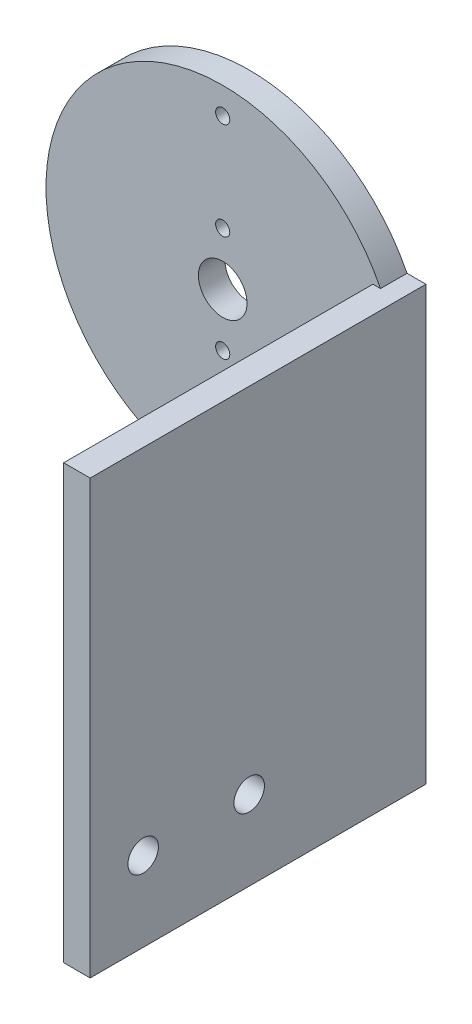
ISO-10303-21;
HEADER;
FILE_DESCRIPTION(('STEP AP214'),'2;1');
FILE_NAME('part.step','',(''),(''),'','','');
FILE_SCHEMA(('AUTOMOTIVE_DESIGN { 1 0 10303 214 1 1 1 1 }'));
ENDSEC;
DATA;
#1=APPLICATION_CONTEXT('core data for automotive mechanical design processes');
#2=APPLICATION_PROTOCOL_DEFINITION('international standard','automotive_design',2000,#1);
#3=PRODUCT_CONTEXT('',#1,'mechanical');
#4=PRODUCT('Part','Part','',(#3));
#5=PRODUCT_RELATED_PRODUCT_CATEGORY('part','',(#4));
#6=PRODUCT_DEFINITION_FORMATION('','',#4);
#7=PRODUCT_DEFINITION_CONTEXT('part definition',#1,'design');
#8=PRODUCT_DEFINITION('design','',#6,#7);
#9=PRODUCT_DEFINITION_SHAPE('','',#8);
#10=(LENGTH_UNIT() NAMED_UNIT(*) SI_UNIT(.MILLI.,.METRE.));
#11=(NAMED_UNIT(*) PLANE_ANGLE_UNIT() SI_UNIT($,.RADIAN.));
#12=(NAMED_UNIT(*) SI_UNIT($,.STERADIAN.) SOLID_ANGLE_UNIT());
#13=UNCERTAINTY_MEASURE_WITH_UNIT(LENGTH_MEASURE(1.E-05),#10,'distance_accuracy_value','');
#14=(GEOMETRIC_REPRESENTATION_CONTEXT(3) GLOBAL_UNCERTAINTY_ASSIGNED_CONTEXT((#13)) GLOBAL_UNIT_ASSIGNED_CONTEXT((#10,
#11,#12)) REPRESENTATION_CONTEXT('',''));
#15=CARTESIAN_POINT('',(0.,0.,0.));
#16=DIRECTION('',(0.,0.,1.));
#17=DIRECTION('',(1.,0.,0.));
#18=AXIS2_PLACEMENT_3D('',#15,#16,#17);
#19=CARTESIAN_POINT('',(0.,0.,-23.));
#20=DIRECTION('',(0.,0.,1.));
#21=DIRECTION('',(1.,0.,0.));
#22=AXIS2_PLACEMENT_3D('',#19,#20,#21);
#23=PLANE('',#22);
#24=CARTESIAN_POINT('',(0.,6.,-23.));
#25=DIRECTION('',(0.,0.,1.));
#26=DIRECTION('',(1.,0.,0.));
#27=AXIS2_PLACEMENT_3D('',#24,#25,#26);
#28=CIRCLE('',#27,0.8);
#29=CARTESIAN_POINT('',(0.8,6.,-23.));
#30=VERTEX_POINT('',#29);
#31=EDGE_CURVE('E122',#30,#30,#28,.T.);
#32=ORIENTED_EDGE('',*,*,#31,.F.);
#33=EDGE_LOOP('',(#32));
#34=FACE_BOUND('',#33,.T.);
#35=CARTESIAN_POINT('',(0.,-6.,-23.));
#36=DIRECTION('',(0.,0.,1.));
#37=DIRECTION('',(1.,0.,0.));
#38=AXIS2_PLACEMENT_3D('',#35,#36,#37);
#39=CIRCLE('',#38,0.8);
#40=CARTESIAN_POINT('',(0.8,-6.,-23.));
#41=VERTEX_POINT('',#40);
#42=EDGE_CURVE('E193',#41,#41,#39,.T.);
#43=ORIENTED_EDGE('',*,*,#42,.F.);
#44=EDGE_LOOP('',(#43));
#45=FACE_BOUND('',#44,.T.);
#46=CARTESIAN_POINT('',(0.,17.,-23.));
#47=DIRECTION('',(0.,0.,1.));
#48=DIRECTION('',(1.,0.,0.));
#49=AXIS2_PLACEMENT_3D('',#46,#47,#48);
#50=CIRCLE('',#49,0.8);
#51=CARTESIAN_POINT('',(0.8,17.,-23.));
#52=VERTEX_POINT('',#51);
#53=EDGE_CURVE('E194',#52,#52,#50,.T.);
#54=ORIENTED_EDGE('',*,*,#53,.F.);
#55=EDGE_LOOP('',(#54));
#56=FACE_BOUND('',#55,.T.);
#57=CARTESIAN_POINT('',(0.,-17.,-23.));
#58=DIRECTION('',(0.,0.,1.));
#59=DIRECTION('',(1.,0.,0.));
#60=AXIS2_PLACEMENT_3D('',#57,#58,#59);
#61=CIRCLE('',#60,0.8);
#62=CARTESIAN_POINT('',(0.8,-17.,-23.));
#63=VERTEX_POINT('',#62);
#64=EDGE_CURVE('E189',#63,#63,#61,.T.);
#65=ORIENTED_EDGE('',*,*,#64,.F.);
#66=EDGE_LOOP('',(#65));
#67=FACE_BOUND('',#66,.T.);
#68=CARTESIAN_POINT('',(0.,0.,-23.));
#69=DIRECTION('',(0.,0.,1.));
#70=DIRECTION('',(1.,0.,0.));
#71=AXIS2_PLACEMENT_3D('',#68,#69,#70);
#72=CIRCLE('',#71,2.75);
#73=CARTESIAN_POINT('',(2.75,0.,-23.));
#74=VERTEX_POINT('',#73);
#75=EDGE_CURVE('E184',#74,#74,#72,.T.);
#76=ORIENTED_EDGE('',*,*,#75,.F.);
#77=EDGE_LOOP('',(#76));
#78=FACE_BOUND('',#77,.T.);
#79=DIRECTION('',(1.,0.,0.));
#80=VECTOR('',#79,1.);
#81=CARTESIAN_POINT('',(0.,-40.,-23.));
#82=LINE('',#81,#80);
#83=CARTESIAN_POINT('',(0.,-40.,-23.));
#84=VERTEX_POINT('',#83);
#85=CARTESIAN_POINT('',(17.,-40.,-23.));
#86=VERTEX_POINT('',#85);
#87=EDGE_CURVE('E135',#84,#86,#82,.T.);
#88=ORIENTED_EDGE('',*,*,#87,.T.);
#89=DIRECTION('',(0.,1.,0.));
#90=VECTOR('',#89,1.);
#91=CARTESIAN_POINT('',(17.,0.,-23.));
#92=LINE('',#91,#90);
#93=CARTESIAN_POINT('',(17.,9.,-23.));
#94=VERTEX_POINT('',#93);
#95=EDGE_CURVE('E11',#86,#94,#92,.T.);
#96=ORIENTED_EDGE('',*,*,#95,.T.);
#97=DIRECTION('',(1.,0.,0.));
#98=VECTOR('',#97,1.);
#99=CARTESIAN_POINT('',(0.,9.,-23.));
#100=LINE('',#99,#98);
#101=CARTESIAN_POINT('',(17.8605710994918,9.,-23.));
#102=VERTEX_POINT('',#101);
#103=EDGE_CURVE('E48',#94,#102,#100,.T.);
#104=ORIENTED_EDGE('',*,*,#103,.T.);
#105=CARTESIAN_POINT('',(0.,0.,-23.));
#106=DIRECTION('',(0.,0.,1.));
#107=DIRECTION('',(1.,0.,0.));
#108=AXIS2_PLACEMENT_3D('',#105,#106,#107);
#109=CIRCLE('',#108,20.);
#110=CARTESIAN_POINT('',(0.,-20.,-23.));
#111=VERTEX_POINT('',#110);
#112=EDGE_CURVE('E154',#102,#111,#109,.T.);
#113=ORIENTED_EDGE('',*,*,#112,.T.);
#114=DIRECTION('',(0.,-1.,0.));
#115=VECTOR('',#114,1.);
#116=CARTESIAN_POINT('',(0.,9.,-23.));
#117=LINE('',#116,#115);
#118=EDGE_CURVE('E134',#111,#84,#117,.T.);
#119=ORIENTED_EDGE('',*,*,#118,.T.);
#120=EDGE_LOOP('',(#88,#96,#104,#113,#119));
#121=FACE_BOUND('',#120,.T.);
#122=ADVANCED_FACE('F39',(#34,#45,#56,#67,#78,#121),#23,.T.);
#123=CARTESIAN_POINT('',(0.,0.,-23.));
#124=DIRECTION('',(0.,0.,-1.));
#125=DIRECTION('',(-1.,0.,0.));
#126=AXIS2_PLACEMENT_3D('',#123,#124,#125);
#127=CYLINDRICAL_SURFACE('',#126,20.);
#128=DIRECTION('',(0.,0.,-1.));
#129=VECTOR('',#128,1.);
#130=CARTESIAN_POINT('',(0.,-20.,-23.));
#131=LINE('',#130,#129);
#132=CARTESIAN_POINT('',(0.,-20.,-26.));
#133=VERTEX_POINT('',#132);
#134=EDGE_CURVE('E57',#111,#133,#131,.T.);
#135=ORIENTED_EDGE('',*,*,#134,.F.);
#136=ORIENTED_EDGE('',*,*,#112,.F.);
#137=DIRECTION('',(0.,0.,-1.));
#138=VECTOR('',#137,1.);
#139=CARTESIAN_POINT('',(17.8605710994918,9.,-23.));
#140=LINE('',#139,#138);
#141=CARTESIAN_POINT('',(17.8605710994918,9.,-26.));
#142=VERTEX_POINT('',#141);
#143=EDGE_CURVE('E148',#142,#102,#140,.F.);
#144=ORIENTED_EDGE('',*,*,#143,.F.);
#145=CARTESIAN_POINT('',(0.,0.,-26.));
#146=DIRECTION('',(0.,0.,1.));
#147=DIRECTION('',(1.,0.,0.));
#148=AXIS2_PLACEMENT_3D('',#145,#146,#147);
#149=CIRCLE('',#148,20.);
#150=EDGE_CURVE('E64',#142,#133,#149,.T.);
#151=ORIENTED_EDGE('',*,*,#150,.T.);
#152=EDGE_LOOP('',(#135,#136,#144,#151));
#153=FACE_BOUND('',#152,.T.);
#154=ADVANCED_FACE('F41',(#153),#127,.T.);
#155=CARTESIAN_POINT('',(0.,0.,-26.));
#156=DIRECTION('',(0.,0.,1.));
#157=DIRECTION('',(1.,0.,0.));
#158=AXIS2_PLACEMENT_3D('',#155,#156,#157);
#159=PLANE('',#158);
#160=CARTESIAN_POINT('',(0.,6.,-26.));
#161=DIRECTION('',(0.,0.,1.));
#162=DIRECTION('',(1.,0.,0.));
#163=AXIS2_PLACEMENT_3D('',#160,#161,#162);
#164=CIRCLE('',#163,0.8);
#165=CARTESIAN_POINT('',(0.8,6.,-26.));
#166=VERTEX_POINT('',#165);
#167=EDGE_CURVE('E180',#166,#166,#164,.T.);
#168=ORIENTED_EDGE('',*,*,#167,.T.);
#169=EDGE_LOOP('',(#168));
#170=FACE_BOUND('',#169,.T.);
#171=CARTESIAN_POINT('',(0.,-6.,-26.));
#172=DIRECTION('',(0.,0.,1.));
#173=DIRECTION('',(1.,0.,0.));
#174=AXIS2_PLACEMENT_3D('',#171,#172,#173);
#175=CIRCLE('',#174,0.8);
#176=CARTESIAN_POINT('',(0.8,-6.,-26.));
#177=VERTEX_POINT('',#176);
#178=EDGE_CURVE('E172',#177,#177,#175,.T.);
#179=ORIENTED_EDGE('',*,*,#178,.T.);
#180=EDGE_LOOP('',(#179));
#181=FACE_BOUND('',#180,.T.);
#182=CARTESIAN_POINT('',(0.,17.,-26.));
#183=DIRECTION('',(0.,0.,1.));
#184=DIRECTION('',(1.,0.,0.));
#185=AXIS2_PLACEMENT_3D('',#182,#183,#184);
#186=CIRCLE('',#185,0.8);
#187=CARTESIAN_POINT('',(0.8,17.,-26.));
#188=VERTEX_POINT('',#187);
#189=EDGE_CURVE('E171',#188,#188,#186,.T.);
#190=ORIENTED_EDGE('',*,*,#189,.T.);
#191=EDGE_LOOP('',(#190));
#192=FACE_BOUND('',#191,.T.);
#193=CARTESIAN_POINT('',(0.,-17.,-26.));
#194=DIRECTION('',(0.,0.,1.));
#195=DIRECTION('',(1.,0.,0.));
#196=AXIS2_PLACEMENT_3D('',#193,#194,#195);
#197=CIRCLE('',#196,0.8);
#198=CARTESIAN_POINT('',(0.8,-17.,-26.));
#199=VERTEX_POINT('',#198);
#200=EDGE_CURVE('E162',#199,#199,#197,.T.);
#201=ORIENTED_EDGE('',*,*,#200,.T.);
#202=EDGE_LOOP('',(#201));
#203=FACE_BOUND('',#202,.T.);
#204=CARTESIAN_POINT('',(0.,0.,-26.));
#205=DIRECTION('',(0.,0.,1.));
#206=DIRECTION('',(1.,0.,0.));
#207=AXIS2_PLACEMENT_3D('',#204,#205,#206);
#208=CIRCLE('',#207,2.75);
#209=CARTESIAN_POINT('',(2.75,0.,-26.));
#210=VERTEX_POINT('',#209);
#211=EDGE_CURVE('E179',#210,#210,#208,.T.);
#212=ORIENTED_EDGE('',*,*,#211,.T.);
#213=EDGE_LOOP('',(#212));
#214=FACE_BOUND('',#213,.T.);
#215=DIRECTION('',(0.,1.,0.));
#216=VECTOR('',#215,1.);
#217=CARTESIAN_POINT('',(20.,-40.,-26.));
#218=LINE('',#217,#216);
#219=CARTESIAN_POINT('',(20.,-40.,-26.));
#220=VERTEX_POINT('',#219);
#221=CARTESIAN_POINT('',(20.,9.,-26.));
#222=VERTEX_POINT('',#221);
#223=EDGE_CURVE('E138',#220,#222,#218,.T.);
#224=ORIENTED_EDGE('',*,*,#223,.F.);
#225=DIRECTION('',(1.,0.,0.));
#226=VECTOR('',#225,1.);
#227=CARTESIAN_POINT('',(0.,-40.,-26.));
#228=LINE('',#227,#226);
#229=CARTESIAN_POINT('',(0.,-40.,-26.));
#230=VERTEX_POINT('',#229);
#231=EDGE_CURVE('E126',#230,#220,#228,.T.);
#232=ORIENTED_EDGE('',*,*,#231,.F.);
#233=DIRECTION('',(0.,-1.,0.));
#234=VECTOR('',#233,1.);
#235=CARTESIAN_POINT('',(0.,9.,-26.));
#236=LINE('',#235,#234);
#237=EDGE_CURVE('E121',#133,#230,#236,.T.);
#238=ORIENTED_EDGE('',*,*,#237,.F.);
#239=ORIENTED_EDGE('',*,*,#150,.F.);
#240=DIRECTION('',(-1.,0.,0.));
#241=VECTOR('',#240,1.);
#242=CARTESIAN_POINT('',(20.,9.,-26.));
#243=LINE('',#242,#241);
#244=EDGE_CURVE('E131',#222,#142,#243,.T.);
#245=ORIENTED_EDGE('',*,*,#244,.F.);
#246=EDGE_LOOP('',(#224,#232,#238,#239,#245));
#247=FACE_BOUND('',#246,.T.);
#248=ADVANCED_FACE('F211',(#170,#181,#192,#203,#214,#247),#159,.F.);
#249=CARTESIAN_POINT('',(0.,9.,-23.));
#250=DIRECTION('',(1.,0.,0.));
#251=DIRECTION('',(0.,0.,-1.));
#252=AXIS2_PLACEMENT_3D('',#249,#250,#251);
#253=PLANE('',#252);
#254=ORIENTED_EDGE('',*,*,#118,.F.);
#255=ORIENTED_EDGE('',*,*,#134,.T.);
#256=ORIENTED_EDGE('',*,*,#237,.T.);
#257=DIRECTION('',(0.,0.,-1.));
#258=VECTOR('',#257,1.);
#259=CARTESIAN_POINT('',(0.,-40.,-23.));
#260=LINE('',#259,#258);
#261=EDGE_CURVE('E149',#84,#230,#260,.T.);
#262=ORIENTED_EDGE('',*,*,#261,.F.);
#263=EDGE_LOOP('',(#254,#255,#256,#262));
#264=FACE_BOUND('',#263,.T.);
#265=ADVANCED_FACE('F210',(#264),#253,.F.);
#266=CARTESIAN_POINT('',(20.,-40.,-23.));
#267=DIRECTION('',(-1.,0.,0.));
#268=DIRECTION('',(0.,0.,1.));
#269=AXIS2_PLACEMENT_3D('',#266,#267,#268);
#270=PLANE('',#269);
#271=CARTESIAN_POINT('',(20.,-31.,6.));
#272=DIRECTION('',(1.,0.,0.));
#273=DIRECTION('',(0.,0.,-1.));
#274=AXIS2_PLACEMENT_3D('',#271,#272,#273);
#275=CIRCLE('',#274,1.725);
#276=CARTESIAN_POINT('',(20.,-31.,4.275));
#277=VERTEX_POINT('',#276);
#278=EDGE_CURVE('E157',#277,#277,#275,.T.);
#279=ORIENTED_EDGE('',*,*,#278,.F.);
#280=EDGE_LOOP('',(#279));
#281=FACE_BOUND('',#280,.T.);
#282=CARTESIAN_POINT('',(20.,-31.,-6.));
#283=DIRECTION('',(1.,0.,0.));
#284=DIRECTION('',(0.,0.,-1.));
#285=AXIS2_PLACEMENT_3D('',#282,#283,#284);
#286=CIRCLE('',#285,1.725);
#287=CARTESIAN_POINT('',(20.,-31.,-7.725));
#288=VERTEX_POINT('',#287);
#289=EDGE_CURVE('E165',#288,#288,#286,.T.);
#290=ORIENTED_EDGE('',*,*,#289,.F.);
#291=EDGE_LOOP('',(#290));
#292=FACE_BOUND('',#291,.T.);
#293=DIRECTION('',(0.,0.,-1.));
#294=VECTOR('',#293,1.);
#295=CARTESIAN_POINT('',(20.,9.,-23.));
#296=LINE('',#295,#294);
#297=CARTESIAN_POINT('',(20.,9.,12.));
#298=VERTEX_POINT('',#297);
#299=EDGE_CURVE('E136',#298,#222,#296,.T.);
#300=ORIENTED_EDGE('',*,*,#299,.F.);
#301=DIRECTION('',(0.,1.,0.));
#302=VECTOR('',#301,1.);
#303=CARTESIAN_POINT('',(20.,-40.,12.));
#304=LINE('',#303,#302);
#305=CARTESIAN_POINT('',(20.,-40.,12.));
#306=VERTEX_POINT('',#305);
#307=EDGE_CURVE('E111',#306,#298,#304,.T.);
#308=ORIENTED_EDGE('',*,*,#307,.F.);
#309=DIRECTION('',(0.,0.,-1.));
#310=VECTOR('',#309,1.);
#311=CARTESIAN_POINT('',(20.,-40.,-23.));
#312=LINE('',#311,#310);
#313=EDGE_CURVE('E110',#306,#220,#312,.T.);
#314=ORIENTED_EDGE('',*,*,#313,.T.);
#315=ORIENTED_EDGE('',*,*,#223,.T.);
#316=EDGE_LOOP('',(#300,#308,#314,#315));
#317=FACE_BOUND('',#316,.T.);
#318=ADVANCED_FACE('F215',(#281,#292,#317),#270,.F.);
#319=CARTESIAN_POINT('',(20.,9.,-23.));
#320=DIRECTION('',(0.,-1.,0.));
#321=DIRECTION('',(0.,0.,-1.));
#322=AXIS2_PLACEMENT_3D('',#319,#320,#321);
#323=PLANE('',#322);
#324=ORIENTED_EDGE('',*,*,#244,.T.);
#325=ORIENTED_EDGE('',*,*,#143,.T.);
#326=ORIENTED_EDGE('',*,*,#103,.F.);
#327=DIRECTION('',(0.,0.,-1.));
#328=VECTOR('',#327,1.);
#329=CARTESIAN_POINT('',(17.,9.,12.));
#330=LINE('',#329,#328);
#331=CARTESIAN_POINT('',(17.,9.,12.));
#332=VERTEX_POINT('',#331);
#333=EDGE_CURVE('E123',#332,#94,#330,.T.);
#334=ORIENTED_EDGE('',*,*,#333,.F.);
#335=DIRECTION('',(-1.,0.,0.));
#336=VECTOR('',#335,1.);
#337=CARTESIAN_POINT('',(20.,9.,12.));
#338=LINE('',#337,#336);
#339=EDGE_CURVE('E120',#298,#332,#338,.T.);
#340=ORIENTED_EDGE('',*,*,#339,.F.);
#341=ORIENTED_EDGE('',*,*,#299,.T.);
#342=EDGE_LOOP('',(#324,#325,#326,#334,#340,#341));
#343=FACE_BOUND('',#342,.T.);
#344=ADVANCED_FACE('F201',(#343),#323,.F.);
#345=CARTESIAN_POINT('',(0.,-40.,-23.));
#346=DIRECTION('',(0.,1.,0.));
#347=DIRECTION('',(0.,0.,1.));
#348=AXIS2_PLACEMENT_3D('',#345,#346,#347);
#349=PLANE('',#348);
#350=ORIENTED_EDGE('',*,*,#313,.F.);
#351=DIRECTION('',(1.,0.,0.));
#352=VECTOR('',#351,1.);
#353=CARTESIAN_POINT('',(17.,-40.,12.));
#354=LINE('',#353,#352);
#355=CARTESIAN_POINT('',(17.,-40.,12.));
#356=VERTEX_POINT('',#355);
#357=EDGE_CURVE('E100',#356,#306,#354,.T.);
#358=ORIENTED_EDGE('',*,*,#357,.F.);
#359=DIRECTION('',(0.,0.,-1.));
#360=VECTOR('',#359,1.);
#361=CARTESIAN_POINT('',(17.,-40.,12.));
#362=LINE('',#361,#360);
#363=EDGE_CURVE('E104',#356,#86,#362,.T.);
#364=ORIENTED_EDGE('',*,*,#363,.T.);
#365=ORIENTED_EDGE('',*,*,#87,.F.);
#366=ORIENTED_EDGE('',*,*,#261,.T.);
#367=ORIENTED_EDGE('',*,*,#231,.T.);
#368=EDGE_LOOP('',(#350,#358,#364,#365,#366,#367));
#369=FACE_BOUND('',#368,.T.);
#370=ADVANCED_FACE('F103',(#369),#349,.F.);
#371=CARTESIAN_POINT('',(17.,9.,12.));
#372=DIRECTION('',(1.,0.,0.));
#373=DIRECTION('',(0.,0.,-1.));
#374=AXIS2_PLACEMENT_3D('',#371,#372,#373);
#375=PLANE('',#374);
#376=CARTESIAN_POINT('',(17.,-31.,6.));
#377=DIRECTION('',(1.,0.,0.));
#378=DIRECTION('',(0.,0.,-1.));
#379=AXIS2_PLACEMENT_3D('',#376,#377,#378);
#380=CIRCLE('',#379,1.725);
#381=CARTESIAN_POINT('',(17.,-31.,4.275));
#382=VERTEX_POINT('',#381);
#383=EDGE_CURVE('E43',#382,#382,#380,.T.);
#384=ORIENTED_EDGE('',*,*,#383,.T.);
#385=EDGE_LOOP('',(#384));
#386=FACE_BOUND('',#385,.T.);
#387=CARTESIAN_POINT('',(17.,-31.,-6.));
#388=DIRECTION('',(1.,0.,0.));
#389=DIRECTION('',(0.,0.,-1.));
#390=AXIS2_PLACEMENT_3D('',#387,#388,#389);
#391=CIRCLE('',#390,1.725);
#392=CARTESIAN_POINT('',(17.,-31.,-7.725));
#393=VERTEX_POINT('',#392);
#394=EDGE_CURVE('E156',#393,#393,#391,.T.);
#395=ORIENTED_EDGE('',*,*,#394,.T.);
#396=EDGE_LOOP('',(#395));
#397=FACE_BOUND('',#396,.T.);
#398=ORIENTED_EDGE('',*,*,#95,.F.);
#399=ORIENTED_EDGE('',*,*,#363,.F.);
#400=DIRECTION('',(0.,-1.,0.));
#401=VECTOR('',#400,1.);
#402=CARTESIAN_POINT('',(17.,9.,12.));
#403=LINE('',#402,#401);
#404=EDGE_CURVE('E115',#332,#356,#403,.T.);
#405=ORIENTED_EDGE('',*,*,#404,.F.);
#406=ORIENTED_EDGE('',*,*,#333,.T.);
#407=EDGE_LOOP('',(#398,#399,#405,#406));
#408=FACE_BOUND('',#407,.T.);
#409=ADVANCED_FACE('F124',(#386,#397,#408),#375,.F.);
#410=CARTESIAN_POINT('',(0.,0.,12.));
#411=DIRECTION('',(0.,0.,1.));
#412=DIRECTION('',(1.,0.,0.));
#413=AXIS2_PLACEMENT_3D('',#410,#411,#412);
#414=PLANE('',#413);
#415=ORIENTED_EDGE('',*,*,#404,.T.);
#416=ORIENTED_EDGE('',*,*,#357,.T.);
#417=ORIENTED_EDGE('',*,*,#307,.T.);
#418=ORIENTED_EDGE('',*,*,#339,.T.);
#419=EDGE_LOOP('',(#415,#416,#417,#418));
#420=FACE_BOUND('',#419,.T.);
#421=ADVANCED_FACE('F114',(#420),#414,.T.);
#422=CARTESIAN_POINT('',(0.,0.,-26.));
#423=DIRECTION('',(0.,0.,1.));
#424=DIRECTION('',(1.,0.,0.));
#425=AXIS2_PLACEMENT_3D('',#422,#423,#424);
#426=CYLINDRICAL_SURFACE('',#425,2.75);
#427=ORIENTED_EDGE('',*,*,#75,.T.);
#428=EDGE_LOOP('',(#427));
#429=FACE_BOUND('',#428,.T.);
#430=ORIENTED_EDGE('',*,*,#211,.F.);
#431=EDGE_LOOP('',(#430));
#432=FACE_BOUND('',#431,.T.);
#433=ADVANCED_FACE('F252',(#429,#432),#426,.F.);
#434=CARTESIAN_POINT('',(0.,-17.,-26.));
#435=DIRECTION('',(0.,0.,1.));
#436=DIRECTION('',(1.,0.,0.));
#437=AXIS2_PLACEMENT_3D('',#434,#435,#436);
#438=CYLINDRICAL_SURFACE('',#437,0.8);
#439=ORIENTED_EDGE('',*,*,#64,.T.);
#440=EDGE_LOOP('',(#439));
#441=FACE_BOUND('',#440,.T.);
#442=ORIENTED_EDGE('',*,*,#200,.F.);
#443=EDGE_LOOP('',(#442));
#444=FACE_BOUND('',#443,.T.);
#445=ADVANCED_FACE('F255',(#441,#444),#438,.F.);
#446=CARTESIAN_POINT('',(0.,17.,-26.));
#447=DIRECTION('',(0.,0.,1.));
#448=DIRECTION('',(1.,0.,0.));
#449=AXIS2_PLACEMENT_3D('',#446,#447,#448);
#450=CYLINDRICAL_SURFACE('',#449,0.8);
#451=ORIENTED_EDGE('',*,*,#53,.T.);
#452=EDGE_LOOP('',(#451));
#453=FACE_BOUND('',#452,.T.);
#454=ORIENTED_EDGE('',*,*,#189,.F.);
#455=EDGE_LOOP('',(#454));
#456=FACE_BOUND('',#455,.T.);
#457=ADVANCED_FACE('F260',(#453,#456),#450,.F.);
#458=CARTESIAN_POINT('',(0.,-6.,-26.));
#459=DIRECTION('',(0.,0.,1.));
#460=DIRECTION('',(1.,0.,0.));
#461=AXIS2_PLACEMENT_3D('',#458,#459,#460);
#462=CYLINDRICAL_SURFACE('',#461,0.8);
#463=ORIENTED_EDGE('',*,*,#42,.T.);
#464=EDGE_LOOP('',(#463));
#465=FACE_BOUND('',#464,.T.);
#466=ORIENTED_EDGE('',*,*,#178,.F.);
#467=EDGE_LOOP('',(#466));
#468=FACE_BOUND('',#467,.T.);
#469=ADVANCED_FACE('F262',(#465,#468),#462,.F.);
#470=CARTESIAN_POINT('',(0.,6.,-26.));
#471=DIRECTION('',(0.,0.,1.));
#472=DIRECTION('',(1.,0.,0.));
#473=AXIS2_PLACEMENT_3D('',#470,#471,#472);
#474=CYLINDRICAL_SURFACE('',#473,0.8);
#475=ORIENTED_EDGE('',*,*,#31,.T.);
#476=EDGE_LOOP('',(#475));
#477=FACE_BOUND('',#476,.T.);
#478=ORIENTED_EDGE('',*,*,#167,.F.);
#479=EDGE_LOOP('',(#478));
#480=FACE_BOUND('',#479,.T.);
#481=ADVANCED_FACE('F278',(#477,#480),#474,.F.);
#482=CARTESIAN_POINT('',(-20.,-31.,-6.));
#483=DIRECTION('',(1.,0.,0.));
#484=DIRECTION('',(0.,0.,-1.));
#485=AXIS2_PLACEMENT_3D('',#482,#483,#484);
#486=CYLINDRICAL_SURFACE('',#485,1.725);
#487=ORIENTED_EDGE('',*,*,#289,.T.);
#488=EDGE_LOOP('',(#487));
#489=FACE_BOUND('',#488,.T.);
#490=ORIENTED_EDGE('',*,*,#394,.F.);
#491=EDGE_LOOP('',(#490));
#492=FACE_BOUND('',#491,.T.);
#493=ADVANCED_FACE('F273',(#489,#492),#486,.F.);
#494=CARTESIAN_POINT('',(-20.,-31.,6.));
#495=DIRECTION('',(1.,0.,0.));
#496=DIRECTION('',(0.,0.,-1.));
#497=AXIS2_PLACEMENT_3D('',#494,#495,#496);
#498=CYLINDRICAL_SURFACE('',#497,1.725);
#499=ORIENTED_EDGE('',*,*,#278,.T.);
#500=EDGE_LOOP('',(#499));
#501=FACE_BOUND('',#500,.T.);
#502=ORIENTED_EDGE('',*,*,#383,.F.);
#503=EDGE_LOOP('',(#502));
#504=FACE_BOUND('',#503,.T.);
#505=ADVANCED_FACE('F271',(#501,#504),#498,.F.);
#506=CLOSED_SHELL('',(#122,#154,#248,#265,#318,#344,#370,#409,#421,#433,#445,#457,#469,#481,
#493,#505));
#507=MANIFOLD_SOLID_BREP('B2',#506);
#508=ADVANCED_BREP_SHAPE_REPRESENTATION('',(#18,#507),#14);
#509=SHAPE_DEFINITION_REPRESENTATION(#9,#508);
ENDSEC;
END-ISO-10303-21;
